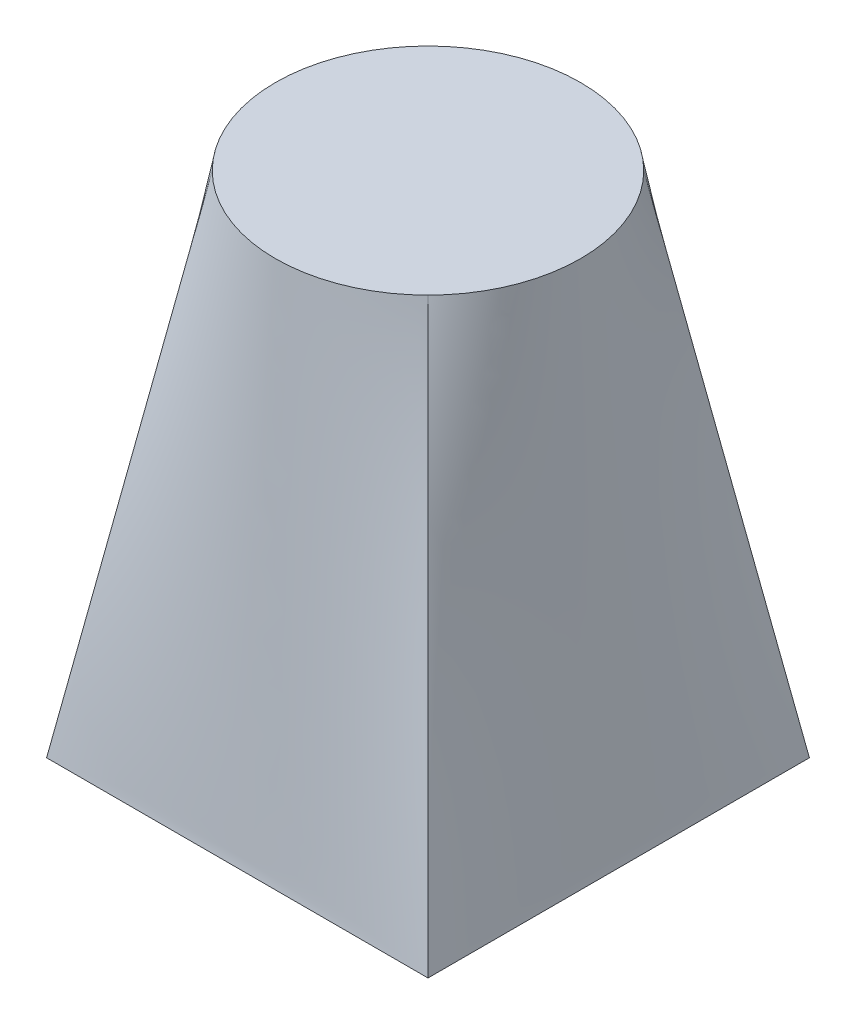
ISO-10303-21;
HEADER;
FILE_DESCRIPTION(('STEP AP214'),'2;1');
FILE_NAME('part.step','',(''),(''),'','','');
FILE_SCHEMA(('AUTOMOTIVE_DESIGN { 1 0 10303 214 1 1 1 1 }'));
ENDSEC;
DATA;
#1=APPLICATION_CONTEXT('core data for automotive mechanical design processes');
#2=APPLICATION_PROTOCOL_DEFINITION('international standard','automotive_design',2000,#1);
#3=PRODUCT_CONTEXT('',#1,'mechanical');
#4=PRODUCT('Part','Part','',(#3));
#5=PRODUCT_RELATED_PRODUCT_CATEGORY('part','',(#4));
#6=PRODUCT_DEFINITION_FORMATION('','',#4);
#7=PRODUCT_DEFINITION_CONTEXT('part definition',#1,'design');
#8=PRODUCT_DEFINITION('design','',#6,#7);
#9=PRODUCT_DEFINITION_SHAPE('','',#8);
#10=(LENGTH_UNIT() NAMED_UNIT(*) SI_UNIT(.MILLI.,.METRE.));
#11=(NAMED_UNIT(*) PLANE_ANGLE_UNIT() SI_UNIT($,.RADIAN.));
#12=(NAMED_UNIT(*) SI_UNIT($,.STERADIAN.) SOLID_ANGLE_UNIT());
#13=UNCERTAINTY_MEASURE_WITH_UNIT(LENGTH_MEASURE(1.E-05),#10,'distance_accuracy_value','');
#14=(GEOMETRIC_REPRESENTATION_CONTEXT(3) GLOBAL_UNCERTAINTY_ASSIGNED_CONTEXT((#13)) GLOBAL_UNIT_ASSIGNED_CONTEXT((#10,
#11,#12)) REPRESENTATION_CONTEXT('',''));
#15=CARTESIAN_POINT('',(0.,0.,0.));
#16=DIRECTION('',(0.,0.,1.));
#17=DIRECTION('',(1.,0.,0.));
#18=AXIS2_PLACEMENT_3D('',#15,#16,#17);
#19=CARTESIAN_POINT('',(0.,40.,0.));
#20=DIRECTION('',(0.,1.,0.));
#21=DIRECTION('',(0.,0.,1.));
#22=AXIS2_PLACEMENT_3D('',#19,#20,#21);
#23=PLANE('',#22);
#24=CARTESIAN_POINT('',(0.,40.,0.));
#25=DIRECTION('',(0.,1.,0.));
#26=DIRECTION('',(0.,0.,1.));
#27=AXIS2_PLACEMENT_3D('',#24,#25,#26);
#28=CIRCLE('',#27,12.);
#29=CARTESIAN_POINT('',(8.48528137423857,40.,8.48528137423857));
#30=VERTEX_POINT('',#29);
#31=CARTESIAN_POINT('',(8.48528137423857,40.,-8.48528137423857));
#32=VERTEX_POINT('',#31);
#33=EDGE_CURVE('E12',#30,#32,#28,.T.);
#34=ORIENTED_EDGE('',*,*,#33,.T.);
#35=CARTESIAN_POINT('',(-8.48528137423857,40.,-8.48528137423857));
#36=VERTEX_POINT('',#35);
#37=EDGE_CURVE('E93',#32,#36,#28,.T.);
#38=ORIENTED_EDGE('',*,*,#37,.T.);
#39=CARTESIAN_POINT('',(-8.48528137423857,40.,8.48528137423857));
#40=VERTEX_POINT('',#39);
#41=EDGE_CURVE('E212',#36,#40,#28,.T.);
#42=ORIENTED_EDGE('',*,*,#41,.T.);
#43=EDGE_CURVE('E135',#40,#30,#28,.T.);
#44=ORIENTED_EDGE('',*,*,#43,.T.);
#45=EDGE_LOOP('',(#34,#38,#42,#44));
#46=FACE_BOUND('',#45,.T.);
#47=ADVANCED_FACE('F81',(#46),#23,.T.);
#48=CARTESIAN_POINT('',(0.,0.,0.));
#49=DIRECTION('',(0.,-1.,0.));
#50=DIRECTION('',(0.,0.,-1.));
#51=AXIS2_PLACEMENT_3D('',#48,#49,#50);
#52=PLANE('',#51);
#53=DIRECTION('',(0.,0.,1.));
#54=VECTOR('',#53,1.);
#55=CARTESIAN_POINT('',(-15.,0.,15.));
#56=LINE('',#55,#54);
#57=CARTESIAN_POINT('',(-15.,0.,-15.));
#58=VERTEX_POINT('',#57);
#59=CARTESIAN_POINT('',(-15.,0.,15.));
#60=VERTEX_POINT('',#59);
#61=EDGE_CURVE('E200',#58,#60,#56,.T.);
#62=ORIENTED_EDGE('',*,*,#61,.F.);
#63=DIRECTION('',(-1.,0.,0.));
#64=VECTOR('',#63,1.);
#65=CARTESIAN_POINT('',(-15.,0.,-15.));
#66=LINE('',#65,#64);
#67=CARTESIAN_POINT('',(15.,0.,-15.));
#68=VERTEX_POINT('',#67);
#69=EDGE_CURVE('E154',#68,#58,#66,.T.);
#70=ORIENTED_EDGE('',*,*,#69,.F.);
#71=DIRECTION('',(0.,0.,-1.));
#72=VECTOR('',#71,1.);
#73=CARTESIAN_POINT('',(15.,0.,-15.));
#74=LINE('',#73,#72);
#75=CARTESIAN_POINT('',(15.,0.,15.));
#76=VERTEX_POINT('',#75);
#77=EDGE_CURVE('E128',#76,#68,#74,.T.);
#78=ORIENTED_EDGE('',*,*,#77,.F.);
#79=DIRECTION('',(1.,0.,0.));
#80=VECTOR('',#79,1.);
#81=CARTESIAN_POINT('',(15.,0.,15.));
#82=LINE('',#81,#80);
#83=EDGE_CURVE('E139',#60,#76,#82,.T.);
#84=ORIENTED_EDGE('',*,*,#83,.F.);
#85=EDGE_LOOP('',(#62,#70,#78,#84));
#86=FACE_BOUND('',#85,.T.);
#87=ADVANCED_FACE('F153',(#86),#52,.T.);
#88=CARTESIAN_POINT('',(15.,0.,-15.));
#89=CARTESIAN_POINT('',(8.48528137423857,40.,-8.48528137423857));
#90=CARTESIAN_POINT('',(13.75,0.,-15.));
#91=CARTESIAN_POINT('',(7.98528137423857,40.,-8.98528137423857));
#92=CARTESIAN_POINT('',(12.5,0.,-15.));
#93=CARTESIAN_POINT('',(7.42213429179073,40.,-9.45953075563343));
#94=CARTESIAN_POINT('',(10.,0.,-15.));
#95=CARTESIAN_POINT('',(6.17709576497244,40.,-10.3157300988592));
#96=CARTESIAN_POINT('',(8.75,0.,-15.));
#97=CARTESIAN_POINT('',(5.49514073957397,40.,-10.6974028452583));
#98=CARTESIAN_POINT('',(6.25000000000001,0.,-15.));
#99=CARTESIAN_POINT('',(4.03711560040373,40.,-11.3284022267239));
#100=CARTESIAN_POINT('',(5.00000000000001,0.,-15.));
#101=CARTESIAN_POINT('',(3.26115963666497,40.,-11.5774195789793));
#102=CARTESIAN_POINT('',(2.50000000000001,0.,-15.));
#103=CARTESIAN_POINT('',(1.6566677502636,40.,-11.9133227207518));
#104=CARTESIAN_POINT('',(1.25000000000001,0.,-15.));
#105=CARTESIAN_POINT('',(0.828427124746192,40.,-12.));
#106=CARTESIAN_POINT('',(-1.24999999999999,0.,-15.));
#107=CARTESIAN_POINT('',(-0.828427124746188,40.,-12.));
#108=CARTESIAN_POINT('',(-2.49999999999999,0.,-15.));
#109=CARTESIAN_POINT('',(-1.65666775026359,40.,-11.9133227207518));
#110=CARTESIAN_POINT('',(-4.99999999999999,0.,-15.));
#111=CARTESIAN_POINT('',(-3.26115963666496,40.,-11.5774195789793));
#112=CARTESIAN_POINT('',(-6.25,0.,-15.));
#113=CARTESIAN_POINT('',(-4.03711560040373,40.,-11.3284022267239));
#114=CARTESIAN_POINT('',(-8.75,0.,-15.));
#115=CARTESIAN_POINT('',(-5.49514073957397,40.,-10.6974028452583));
#116=CARTESIAN_POINT('',(-10.,0.,-15.));
#117=CARTESIAN_POINT('',(-6.17709576497244,40.,-10.3157300988592));
#118=CARTESIAN_POINT('',(-12.5,0.,-15.));
#119=CARTESIAN_POINT('',(-7.42213429179072,40.,-9.45953075563343));
#120=CARTESIAN_POINT('',(-13.75,0.,-15.));
#121=CARTESIAN_POINT('',(-7.98528137423857,40.,-8.98528137423857));
#122=CARTESIAN_POINT('',(-15.,0.,-15.));
#123=CARTESIAN_POINT('',(-8.48528137423857,40.,-8.48528137423857));
#124=B_SPLINE_SURFACE_WITH_KNOTS('',3,1,((#88,#89),(#90,#91),(#92,#93),(#94,#95),(#96,#97),(#98,
#99),(#100,#101),(#102,#103),(#104,#105),(#106,#107),(#108,#109),(#110,#111),(#112,#113),(#114,
#115),(#116,#117),(#118,#119),(#120,#121),(#122,#123)),.UNSPECIFIED.,.F.,.F.,.F.,(4,2,2,2,2,2,2,
2,4),(2,2),(0.,0.125,0.25,0.375,0.5,0.625,0.75,0.875,1.),(0.,1.),.UNSPECIFIED.);
#125=DIRECTION('',(0.158712368837311,0.974484873128413,0.158712368837311));
#126=VECTOR('',#125,1.);
#127=CARTESIAN_POINT('',(-11.7426406871193,20.,-11.7426406871193));
#128=LINE('',#127,#126);
#129=EDGE_CURVE('E248',#58,#36,#128,.T.);
#130=DIRECTION('',(0.158712368837311,-0.974484873128413,-0.158712368837311));
#131=VECTOR('',#130,1.);
#132=CARTESIAN_POINT('',(11.7426406871193,20.,-11.7426406871193));
#133=LINE('',#132,#131);
#134=EDGE_CURVE('E148',#32,#68,#133,.T.);
#135=ORIENTED_EDGE('',*,*,#69,.T.);
#136=ORIENTED_EDGE('',*,*,#129,.T.);
#137=ORIENTED_EDGE('',*,*,#37,.F.);
#138=ORIENTED_EDGE('',*,*,#134,.T.);
#139=EDGE_LOOP('',(#135,#136,#137,#138));
#140=FACE_BOUND('',#139,.T.);
#141=ADVANCED_FACE('F176',(#140),#124,.T.);
#142=CARTESIAN_POINT('',(-15.,0.,-15.));
#143=CARTESIAN_POINT('',(-8.48528137423857,40.,-8.48528137423857));
#144=CARTESIAN_POINT('',(-15.,0.,-13.75));
#145=CARTESIAN_POINT('',(-8.98528137423857,40.,-7.98528137423857));
#146=CARTESIAN_POINT('',(-15.,0.,-12.5));
#147=CARTESIAN_POINT('',(-9.45953075563343,40.,-7.42213429179073));
#148=CARTESIAN_POINT('',(-15.,0.,-10.));
#149=CARTESIAN_POINT('',(-10.3157300988592,40.,-6.17709576497245));
#150=CARTESIAN_POINT('',(-15.,0.,-8.75));
#151=CARTESIAN_POINT('',(-10.6974028452583,40.,-5.49514073957397));
#152=CARTESIAN_POINT('',(-15.,0.,-6.25000000000001));
#153=CARTESIAN_POINT('',(-11.3284022267239,40.,-4.03711560040373));
#154=CARTESIAN_POINT('',(-15.,0.,-5.00000000000001));
#155=CARTESIAN_POINT('',(-11.5774195789793,40.,-3.26115963666497));
#156=CARTESIAN_POINT('',(-15.,0.,-2.50000000000001));
#157=CARTESIAN_POINT('',(-11.9133227207518,40.,-1.6566677502636));
#158=CARTESIAN_POINT('',(-15.,0.,-1.25000000000001));
#159=CARTESIAN_POINT('',(-12.,40.,-0.828427124746193));
#160=CARTESIAN_POINT('',(-15.,0.,1.24999999999999));
#161=CARTESIAN_POINT('',(-12.,40.,0.828427124746187));
#162=CARTESIAN_POINT('',(-15.,0.,2.49999999999999));
#163=CARTESIAN_POINT('',(-11.9133227207518,40.,1.65666775026359));
#164=CARTESIAN_POINT('',(-15.,0.,4.99999999999999));
#165=CARTESIAN_POINT('',(-11.5774195789793,40.,3.26115963666496));
#166=CARTESIAN_POINT('',(-15.,0.,6.25));
#167=CARTESIAN_POINT('',(-11.3284022267239,40.,4.03711560040372));
#168=CARTESIAN_POINT('',(-15.,0.,8.75));
#169=CARTESIAN_POINT('',(-10.6974028452583,40.,5.49514073957397));
#170=CARTESIAN_POINT('',(-15.,0.,10.));
#171=CARTESIAN_POINT('',(-10.3157300988592,40.,6.17709576497244));
#172=CARTESIAN_POINT('',(-15.,0.,12.5));
#173=CARTESIAN_POINT('',(-9.45953075563343,40.,7.42213429179072));
#174=CARTESIAN_POINT('',(-15.,0.,13.75));
#175=CARTESIAN_POINT('',(-8.98528137423857,40.,7.98528137423857));
#176=CARTESIAN_POINT('',(-15.,0.,15.));
#177=CARTESIAN_POINT('',(-8.48528137423857,40.,8.48528137423857));
#178=B_SPLINE_SURFACE_WITH_KNOTS('',3,1,((#142,#143),(#144,#145),(#146,#147),(#148,#149),(#150,
#151),(#152,#153),(#154,#155),(#156,#157),(#158,#159),(#160,#161),(#162,#163),(#164,#165),(#166,
#167),(#168,#169),(#170,#171),(#172,#173),(#174,#175),(#176,#177)),.UNSPECIFIED.,.F.,.F.,.F.,(4,
2,2,2,2,2,2,2,4),(2,2),(0.,0.125,0.25,0.375,0.5,0.625,0.75,0.875,1.),(0.,1.),.UNSPECIFIED.);
#179=DIRECTION('',(0.158712368837311,0.974484873128413,-0.158712368837311));
#180=VECTOR('',#179,1.);
#181=CARTESIAN_POINT('',(-11.7426406871193,20.,11.7426406871193));
#182=LINE('',#181,#180);
#183=EDGE_CURVE('E136',#60,#40,#182,.T.);
#184=ORIENTED_EDGE('',*,*,#61,.T.);
#185=ORIENTED_EDGE('',*,*,#183,.T.);
#186=ORIENTED_EDGE('',*,*,#41,.F.);
#187=ORIENTED_EDGE('',*,*,#129,.F.);
#188=EDGE_LOOP('',(#184,#185,#186,#187));
#189=FACE_BOUND('',#188,.T.);
#190=ADVANCED_FACE('F243',(#189),#178,.T.);
#191=CARTESIAN_POINT('',(15.,0.,15.));
#192=CARTESIAN_POINT('',(8.48528137423857,40.,8.48528137423857));
#193=CARTESIAN_POINT('',(15.,0.,13.75));
#194=CARTESIAN_POINT('',(8.98528137423857,40.,7.98528137423857));
#195=CARTESIAN_POINT('',(15.,0.,12.5));
#196=CARTESIAN_POINT('',(9.45953075563343,40.,7.42213429179073));
#197=CARTESIAN_POINT('',(15.,0.,10.));
#198=CARTESIAN_POINT('',(10.3157300988592,40.,6.17709576497245));
#199=CARTESIAN_POINT('',(15.,0.,8.75));
#200=CARTESIAN_POINT('',(10.6974028452583,40.,5.49514073957397));
#201=CARTESIAN_POINT('',(15.,0.,6.25000000000001));
#202=CARTESIAN_POINT('',(11.3284022267239,40.,4.03711560040373));
#203=CARTESIAN_POINT('',(15.,0.,5.00000000000001));
#204=CARTESIAN_POINT('',(11.5774195789793,40.,3.26115963666497));
#205=CARTESIAN_POINT('',(15.,0.,2.50000000000001));
#206=CARTESIAN_POINT('',(11.9133227207518,40.,1.6566677502636));
#207=CARTESIAN_POINT('',(15.,0.,1.25000000000001));
#208=CARTESIAN_POINT('',(12.,40.,0.828427124746191));
#209=CARTESIAN_POINT('',(15.,0.,-1.24999999999999));
#210=CARTESIAN_POINT('',(12.,40.,-0.828427124746189));
#211=CARTESIAN_POINT('',(15.,0.,-2.49999999999999));
#212=CARTESIAN_POINT('',(11.9133227207518,40.,-1.65666775026359));
#213=CARTESIAN_POINT('',(15.,0.,-4.99999999999999));
#214=CARTESIAN_POINT('',(11.5774195789793,40.,-3.26115963666496));
#215=CARTESIAN_POINT('',(15.,0.,-6.25));
#216=CARTESIAN_POINT('',(11.3284022267239,40.,-4.03711560040373));
#217=CARTESIAN_POINT('',(15.,0.,-8.75));
#218=CARTESIAN_POINT('',(10.6974028452583,40.,-5.49514073957397));
#219=CARTESIAN_POINT('',(15.,0.,-10.));
#220=CARTESIAN_POINT('',(10.3157300988592,40.,-6.17709576497245));
#221=CARTESIAN_POINT('',(15.,0.,-12.5));
#222=CARTESIAN_POINT('',(9.45953075563343,40.,-7.42213429179072));
#223=CARTESIAN_POINT('',(15.,0.,-13.75));
#224=CARTESIAN_POINT('',(8.98528137423857,40.,-7.98528137423857));
#225=CARTESIAN_POINT('',(15.,0.,-15.));
#226=CARTESIAN_POINT('',(8.48528137423857,40.,-8.48528137423857));
#227=B_SPLINE_SURFACE_WITH_KNOTS('',3,1,((#191,#192),(#193,#194),(#195,#196),(#197,#198),(#199,
#200),(#201,#202),(#203,#204),(#205,#206),(#207,#208),(#209,#210),(#211,#212),(#213,#214),(#215,
#216),(#217,#218),(#219,#220),(#221,#222),(#223,#224),(#225,#226)),.UNSPECIFIED.,.F.,.F.,.F.,(4,
2,2,2,2,2,2,2,4),(2,2),(0.,0.125,0.25,0.375,0.5,0.625,0.75,0.875,1.),(0.,1.),.UNSPECIFIED.);
#228=DIRECTION('',(-0.158712368837311,0.974484873128413,-0.158712368837311));
#229=VECTOR('',#228,1.);
#230=CARTESIAN_POINT('',(11.7426406871193,20.,11.7426406871193));
#231=LINE('',#230,#229);
#232=EDGE_CURVE('E123',#76,#30,#231,.T.);
#233=ORIENTED_EDGE('',*,*,#77,.T.);
#234=ORIENTED_EDGE('',*,*,#134,.F.);
#235=ORIENTED_EDGE('',*,*,#33,.F.);
#236=ORIENTED_EDGE('',*,*,#232,.F.);
#237=EDGE_LOOP('',(#233,#234,#235,#236));
#238=FACE_BOUND('',#237,.T.);
#239=ADVANCED_FACE('F125',(#238),#227,.T.);
#240=CARTESIAN_POINT('',(-15.,0.,15.));
#241=CARTESIAN_POINT('',(-8.48528137423857,40.,8.48528137423857));
#242=CARTESIAN_POINT('',(-13.75,0.,15.));
#243=CARTESIAN_POINT('',(-7.98528137423858,40.,8.98528137423857));
#244=CARTESIAN_POINT('',(-12.5,0.,15.));
#245=CARTESIAN_POINT('',(-7.42213429179073,40.,9.45953075563342));
#246=CARTESIAN_POINT('',(-10.,0.,15.));
#247=CARTESIAN_POINT('',(-6.17709576497245,40.,10.3157300988592));
#248=CARTESIAN_POINT('',(-8.75,0.,15.));
#249=CARTESIAN_POINT('',(-5.49514073957398,40.,10.6974028452583));
#250=CARTESIAN_POINT('',(-6.25,0.,15.));
#251=CARTESIAN_POINT('',(-4.03711560040373,40.,11.3284022267239));
#252=CARTESIAN_POINT('',(-5.,0.,15.));
#253=CARTESIAN_POINT('',(-3.26115963666497,40.,11.5774195789793));
#254=CARTESIAN_POINT('',(-2.5,0.,15.));
#255=CARTESIAN_POINT('',(-1.6566677502636,40.,11.9133227207518));
#256=CARTESIAN_POINT('',(-1.25,0.,15.));
#257=CARTESIAN_POINT('',(-0.828427124746192,40.,12.));
#258=CARTESIAN_POINT('',(1.25,0.,15.));
#259=CARTESIAN_POINT('',(0.828427124746189,40.,12.));
#260=CARTESIAN_POINT('',(2.5,0.,15.));
#261=CARTESIAN_POINT('',(1.65666775026359,40.,11.9133227207518));
#262=CARTESIAN_POINT('',(5.,0.,15.));
#263=CARTESIAN_POINT('',(3.26115963666497,40.,11.5774195789793));
#264=CARTESIAN_POINT('',(6.25,0.,15.));
#265=CARTESIAN_POINT('',(4.03711560040373,40.,11.3284022267239));
#266=CARTESIAN_POINT('',(8.75,0.,15.));
#267=CARTESIAN_POINT('',(5.49514073957397,40.,10.6974028452583));
#268=CARTESIAN_POINT('',(9.99999999999999,0.,15.));
#269=CARTESIAN_POINT('',(6.17709576497245,40.,10.3157300988592));
#270=CARTESIAN_POINT('',(12.5,0.,15.));
#271=CARTESIAN_POINT('',(7.42213429179073,40.,9.45953075563343));
#272=CARTESIAN_POINT('',(13.75,0.,15.));
#273=CARTESIAN_POINT('',(7.98528137423857,40.,8.98528137423857));
#274=CARTESIAN_POINT('',(15.,0.,15.));
#275=CARTESIAN_POINT('',(8.48528137423857,40.,8.48528137423857));
#276=B_SPLINE_SURFACE_WITH_KNOTS('',3,1,((#240,#241),(#242,#243),(#244,#245),(#246,#247),(#248,
#249),(#250,#251),(#252,#253),(#254,#255),(#256,#257),(#258,#259),(#260,#261),(#262,#263),(#264,
#265),(#266,#267),(#268,#269),(#270,#271),(#272,#273),(#274,#275)),.UNSPECIFIED.,.F.,.F.,.F.,(4,
2,2,2,2,2,2,2,4),(2,2),(0.,0.125,0.25,0.375,0.5,0.625,0.75,0.875,1.),(0.,1.),.UNSPECIFIED.);
#277=ORIENTED_EDGE('',*,*,#83,.T.);
#278=ORIENTED_EDGE('',*,*,#232,.T.);
#279=ORIENTED_EDGE('',*,*,#43,.F.);
#280=ORIENTED_EDGE('',*,*,#183,.F.);
#281=EDGE_LOOP('',(#277,#278,#279,#280));
#282=FACE_BOUND('',#281,.T.);
#283=ADVANCED_FACE('F141',(#282),#276,.T.);
#284=CLOSED_SHELL('',(#47,#87,#141,#190,#239,#283));
#285=MANIFOLD_SOLID_BREP('B2',#284);
#286=ADVANCED_BREP_SHAPE_REPRESENTATION('',(#18,#285),#14);
#287=SHAPE_DEFINITION_REPRESENTATION(#9,#286);
ENDSEC;
END-ISO-10303-21;
